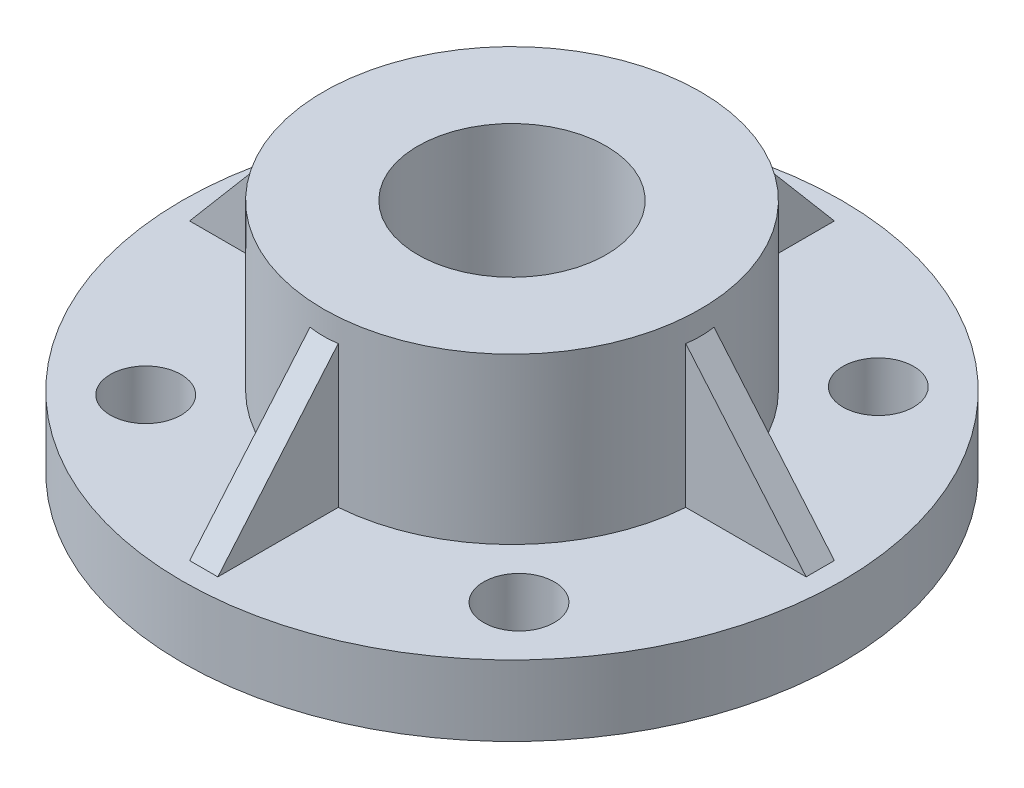
ISO-10303-21;
HEADER;
FILE_DESCRIPTION(('STEP AP214'),'2;1');
FILE_NAME('part.step','',(''),(''),'','','');
FILE_SCHEMA(('AUTOMOTIVE_DESIGN { 1 0 10303 214 1 1 1 1 }'));
ENDSEC;
DATA;
#1=APPLICATION_CONTEXT('core data for automotive mechanical design processes');
#2=APPLICATION_PROTOCOL_DEFINITION('international standard','automotive_design',2000,#1);
#3=PRODUCT_CONTEXT('',#1,'mechanical');
#4=PRODUCT('Part','Part','',(#3));
#5=PRODUCT_RELATED_PRODUCT_CATEGORY('part','',(#4));
#6=PRODUCT_DEFINITION_FORMATION('','',#4);
#7=PRODUCT_DEFINITION_CONTEXT('part definition',#1,'design');
#8=PRODUCT_DEFINITION('design','',#6,#7);
#9=PRODUCT_DEFINITION_SHAPE('','',#8);
#10=(LENGTH_UNIT() NAMED_UNIT(*) SI_UNIT(.MILLI.,.METRE.));
#11=(NAMED_UNIT(*) PLANE_ANGLE_UNIT() SI_UNIT($,.RADIAN.));
#12=(NAMED_UNIT(*) SI_UNIT($,.STERADIAN.) SOLID_ANGLE_UNIT());
#13=UNCERTAINTY_MEASURE_WITH_UNIT(LENGTH_MEASURE(1.E-05),#10,'distance_accuracy_value','');
#14=(GEOMETRIC_REPRESENTATION_CONTEXT(3) GLOBAL_UNCERTAINTY_ASSIGNED_CONTEXT((#13)) GLOBAL_UNIT_ASSIGNED_CONTEXT((#10,
#11,#12)) REPRESENTATION_CONTEXT('',''));
#15=CARTESIAN_POINT('',(0.,0.,0.));
#16=DIRECTION('',(0.,0.,1.));
#17=DIRECTION('',(1.,0.,0.));
#18=AXIS2_PLACEMENT_3D('',#15,#16,#17);
#19=CARTESIAN_POINT('',(20.,49.0897895819615,0.));
#20=DIRECTION('',(0.,1.,0.));
#21=DIRECTION('',(0.,0.,1.));
#22=AXIS2_PLACEMENT_3D('',#19,#20,#21);
#23=PLANE('',#22);
#24=CARTESIAN_POINT('',(0.,49.0897895819615,0.));
#25=DIRECTION('',(0.,-1.,0.));
#26=DIRECTION('',(0.,0.,-1.));
#27=AXIS2_PLACEMENT_3D('',#24,#25,#26);
#28=CIRCLE('',#27,20.);
#29=CARTESIAN_POINT('',(0.,49.0897895819615,-20.));
#30=VERTEX_POINT('',#29);
#31=EDGE_CURVE('E275',#30,#30,#28,.T.);
#32=ORIENTED_EDGE('',*,*,#31,.T.);
#33=EDGE_LOOP('',(#32));
#34=FACE_BOUND('',#33,.T.);
#35=CARTESIAN_POINT('',(0.,49.0897895819615,0.));
#36=DIRECTION('',(0.,-1.,0.));
#37=DIRECTION('',(0.,0.,-1.));
#38=AXIS2_PLACEMENT_3D('',#35,#36,#37);
#39=CIRCLE('',#38,40.);
#40=CARTESIAN_POINT('',(0.,49.0897895819615,-40.));
#41=VERTEX_POINT('',#40);
#42=EDGE_CURVE('E11',#41,#41,#39,.T.);
#43=ORIENTED_EDGE('',*,*,#42,.F.);
#44=EDGE_LOOP('',(#43));
#45=FACE_BOUND('',#44,.T.);
#46=ADVANCED_FACE('F43',(#34,#45),#23,.T.);
#47=CARTESIAN_POINT('',(0.,0.,0.));
#48=DIRECTION('',(0.,-1.,0.));
#49=DIRECTION('',(0.,0.,-1.));
#50=AXIS2_PLACEMENT_3D('',#47,#48,#49);
#51=CYLINDRICAL_SURFACE('',#50,40.);
#52=DIRECTION('',(0.,-1.,0.));
#53=VECTOR('',#52,1.);
#54=CARTESIAN_POINT('',(3.00000000000014,0.,-39.8873413503583));
#55=LINE('',#54,#53);
#56=CARTESIAN_POINT('',(3.00000000000014,14.0897895819615,-39.8873413503583));
#57=VERTEX_POINT('',#56);
#58=CARTESIAN_POINT('',(3.00000000000014,44.2225973757126,-39.8873413503583));
#59=VERTEX_POINT('',#58);
#60=EDGE_CURVE('E211',#57,#59,#55,.F.);
#61=ORIENTED_EDGE('',*,*,#60,.T.);
#62=CARTESIAN_POINT('',(0.,91.2438409303383,0.));
#63=DIRECTION('',(0.,-0.646888134461805,0.762584907726691));
#64=DIRECTION('',(0.,-0.762584907726691,-0.646888134461805));
#65=AXIS2_PLACEMENT_3D('',#62,#63,#64);
#66=ELLIPSE('',#65,61.8344932749138,40.);
#67=CARTESIAN_POINT('',(-2.99999999999986,44.2225973757126,-39.8873413503583));
#68=VERTEX_POINT('',#67);
#69=EDGE_CURVE('E224',#68,#59,#66,.T.);
#70=ORIENTED_EDGE('',*,*,#69,.F.);
#71=DIRECTION('',(0.,-1.,0.));
#72=VECTOR('',#71,1.);
#73=CARTESIAN_POINT('',(-2.99999999999986,0.,-39.8873413503583));
#74=LINE('',#73,#72);
#75=CARTESIAN_POINT('',(-2.99999999999986,14.0897895819615,-39.8873413503583));
#76=VERTEX_POINT('',#75);
#77=EDGE_CURVE('E218',#76,#68,#74,.F.);
#78=ORIENTED_EDGE('',*,*,#77,.F.);
#79=CARTESIAN_POINT('',(0.,14.0897895819615,0.));
#80=DIRECTION('',(0.,-1.,0.));
#81=DIRECTION('',(0.,0.,-1.));
#82=AXIS2_PLACEMENT_3D('',#79,#80,#81);
#83=CIRCLE('',#82,40.);
#84=CARTESIAN_POINT('',(-39.8873413503583,14.0897895819615,-3.));
#85=VERTEX_POINT('',#84);
#86=EDGE_CURVE('E52',#85,#76,#83,.T.);
#87=ORIENTED_EDGE('',*,*,#86,.F.);
#88=DIRECTION('',(0.,-1.,0.));
#89=VECTOR('',#88,1.);
#90=CARTESIAN_POINT('',(-39.8873413503583,0.,-3.));
#91=LINE('',#90,#89);
#92=CARTESIAN_POINT('',(-39.8873413503583,44.2225973757126,-3.));
#93=VERTEX_POINT('',#92);
#94=EDGE_CURVE('E258',#85,#93,#91,.F.);
#95=ORIENTED_EDGE('',*,*,#94,.T.);
#96=CARTESIAN_POINT('',(0.,91.2438409303383,0.));
#97=DIRECTION('',(0.762584907726691,-0.646888134461805,0.));
#98=DIRECTION('',(-0.646888134461805,-0.762584907726691,0.));
#99=AXIS2_PLACEMENT_3D('',#96,#97,#98);
#100=ELLIPSE('',#99,61.8344932749138,40.);
#101=CARTESIAN_POINT('',(-39.8873413503583,44.2225973757126,3.));
#102=VERTEX_POINT('',#101);
#103=EDGE_CURVE('E272',#102,#93,#100,.T.);
#104=ORIENTED_EDGE('',*,*,#103,.F.);
#105=DIRECTION('',(0.,-1.,0.));
#106=VECTOR('',#105,1.);
#107=CARTESIAN_POINT('',(-39.8873413503583,0.,3.));
#108=LINE('',#107,#106);
#109=CARTESIAN_POINT('',(-39.8873413503583,14.0897895819615,3.));
#110=VERTEX_POINT('',#109);
#111=EDGE_CURVE('E266',#110,#102,#108,.F.);
#112=ORIENTED_EDGE('',*,*,#111,.F.);
#113=CARTESIAN_POINT('',(-3.00000000000042,14.0897895819615,39.8873413503583));
#114=VERTEX_POINT('',#113);
#115=EDGE_CURVE('E291',#114,#110,#83,.T.);
#116=ORIENTED_EDGE('',*,*,#115,.F.);
#117=DIRECTION('',(0.,-1.,0.));
#118=VECTOR('',#117,1.);
#119=CARTESIAN_POINT('',(-3.00000000000042,0.,39.8873413503582));
#120=LINE('',#119,#118);
#121=CARTESIAN_POINT('',(-3.00000000000042,44.2225973757126,39.8873413503582));
#122=VERTEX_POINT('',#121);
#123=EDGE_CURVE('E60',#114,#122,#120,.F.);
#124=ORIENTED_EDGE('',*,*,#123,.T.);
#125=CARTESIAN_POINT('',(0.,91.2438409303383,0.));
#126=DIRECTION('',(0.,-0.646888134461805,-0.762584907726691));
#127=DIRECTION('',(0.,-0.762584907726691,0.646888134461805));
#128=AXIS2_PLACEMENT_3D('',#125,#126,#127);
#129=ELLIPSE('',#128,61.8344932749138,40.);
#130=CARTESIAN_POINT('',(2.99999999999958,44.2225973757126,39.8873413503583));
#131=VERTEX_POINT('',#130);
#132=EDGE_CURVE('E146',#131,#122,#129,.T.);
#133=ORIENTED_EDGE('',*,*,#132,.F.);
#134=DIRECTION('',(0.,-1.,0.));
#135=VECTOR('',#134,1.);
#136=CARTESIAN_POINT('',(2.99999999999958,0.,39.8873413503583));
#137=LINE('',#136,#135);
#138=CARTESIAN_POINT('',(2.99999999999959,14.0897895819615,39.8873413503583));
#139=VERTEX_POINT('',#138);
#140=EDGE_CURVE('E152',#139,#131,#137,.F.);
#141=ORIENTED_EDGE('',*,*,#140,.F.);
#142=CARTESIAN_POINT('',(39.8873413503583,14.0897895819615,3.));
#143=VERTEX_POINT('',#142);
#144=EDGE_CURVE('E160',#143,#139,#83,.T.);
#145=ORIENTED_EDGE('',*,*,#144,.F.);
#146=DIRECTION('',(0.,-1.,0.));
#147=VECTOR('',#146,1.);
#148=CARTESIAN_POINT('',(39.8873413503583,0.,3.));
#149=LINE('',#148,#147);
#150=CARTESIAN_POINT('',(39.8873413503583,44.2225973757126,3.));
#151=VERTEX_POINT('',#150);
#152=EDGE_CURVE('E68',#143,#151,#149,.F.);
#153=ORIENTED_EDGE('',*,*,#152,.T.);
#154=CARTESIAN_POINT('',(0.,91.2438409303383,0.));
#155=DIRECTION('',(-0.762584907726691,-0.646888134461805,0.));
#156=DIRECTION('',(0.646888134461805,-0.762584907726691,0.));
#157=AXIS2_PLACEMENT_3D('',#154,#155,#156);
#158=ELLIPSE('',#157,61.8344932749138,40.);
#159=CARTESIAN_POINT('',(39.8873413503583,44.2225973757126,-3.));
#160=VERTEX_POINT('',#159);
#161=EDGE_CURVE('E196',#160,#151,#158,.T.);
#162=ORIENTED_EDGE('',*,*,#161,.F.);
#163=DIRECTION('',(0.,-1.,0.));
#164=VECTOR('',#163,1.);
#165=CARTESIAN_POINT('',(39.8873413503583,0.,-3.));
#166=LINE('',#165,#164);
#167=CARTESIAN_POINT('',(39.8873413503583,14.0897895819615,-3.));
#168=VERTEX_POINT('',#167);
#169=EDGE_CURVE('E185',#168,#160,#166,.F.);
#170=ORIENTED_EDGE('',*,*,#169,.F.);
#171=EDGE_CURVE('E294',#57,#168,#83,.T.);
#172=ORIENTED_EDGE('',*,*,#171,.F.);
#173=EDGE_LOOP('',(#61,#70,#78,#87,#95,#104,#112,#116,#124,#133,#141,#145,#153,#162,#170,#172));
#174=FACE_BOUND('',#173,.T.);
#175=ORIENTED_EDGE('',*,*,#42,.T.);
#176=EDGE_LOOP('',(#175));
#177=FACE_BOUND('',#176,.T.);
#178=ADVANCED_FACE('F338',(#174,#177),#51,.T.);
#179=CARTESIAN_POINT('',(40.,14.0897895819615,0.));
#180=DIRECTION('',(0.,1.,0.));
#181=DIRECTION('',(0.,0.,1.));
#182=AXIS2_PLACEMENT_3D('',#179,#180,#181);
#183=PLANE('',#182);
#184=CARTESIAN_POINT('',(0.,14.0897895819615,0.));
#185=DIRECTION('',(0.,-1.,0.));
#186=DIRECTION('',(0.,0.,-1.));
#187=AXIS2_PLACEMENT_3D('',#184,#185,#186);
#188=CIRCLE('',#187,70.);
#189=CARTESIAN_POINT('',(0.,14.0897895819615,-70.));
#190=VERTEX_POINT('',#189);
#191=EDGE_CURVE('E287',#190,#190,#188,.T.);
#192=ORIENTED_EDGE('',*,*,#191,.F.);
#193=EDGE_LOOP('',(#192));
#194=FACE_BOUND('',#193,.T.);
#195=DIRECTION('',(1.,0.,0.));
#196=VECTOR('',#195,1.);
#197=CARTESIAN_POINT('',(40.0000000000003,14.0897895819615,-65.44850263521));
#198=LINE('',#197,#196);
#199=CARTESIAN_POINT('',(3.00000000000023,14.0897895819615,-65.4485026352101));
#200=VERTEX_POINT('',#199);
#201=CARTESIAN_POINT('',(-2.99999999999977,14.0897895819615,-65.4485026352101));
#202=VERTEX_POINT('',#201);
#203=EDGE_CURVE('E221',#200,#202,#198,.F.);
#204=ORIENTED_EDGE('',*,*,#203,.F.);
#205=DIRECTION('',(0.,0.,1.));
#206=VECTOR('',#205,1.);
#207=CARTESIAN_POINT('',(3.,14.0897895819615,-1.29184809537196E-13));
#208=LINE('',#207,#206);
#209=EDGE_CURVE('E204',#200,#57,#208,.T.);
#210=ORIENTED_EDGE('',*,*,#209,.T.);
#211=ORIENTED_EDGE('',*,*,#171,.T.);
#212=DIRECTION('',(-1.,0.,0.));
#213=VECTOR('',#212,1.);
#214=CARTESIAN_POINT('',(40.,14.0897895819615,-3.));
#215=LINE('',#214,#213);
#216=CARTESIAN_POINT('',(65.4485026352101,14.0897895819615,-3.));
#217=VERTEX_POINT('',#216);
#218=EDGE_CURVE('E180',#217,#168,#215,.T.);
#219=ORIENTED_EDGE('',*,*,#218,.F.);
#220=DIRECTION('',(0.,0.,1.));
#221=VECTOR('',#220,1.);
#222=CARTESIAN_POINT('',(65.4485026352101,14.0897895819615,0.));
#223=LINE('',#222,#221);
#224=CARTESIAN_POINT('',(65.4485026352101,14.0897895819615,3.));
#225=VERTEX_POINT('',#224);
#226=EDGE_CURVE('E193',#225,#217,#223,.F.);
#227=ORIENTED_EDGE('',*,*,#226,.F.);
#228=DIRECTION('',(-1.,0.,0.));
#229=VECTOR('',#228,1.);
#230=CARTESIAN_POINT('',(40.,14.0897895819615,3.));
#231=LINE('',#230,#229);
#232=EDGE_CURVE('E188',#225,#143,#231,.T.);
#233=ORIENTED_EDGE('',*,*,#232,.T.);
#234=ORIENTED_EDGE('',*,*,#144,.T.);
#235=DIRECTION('',(0.,0.,-1.));
#236=VECTOR('',#235,1.);
#237=CARTESIAN_POINT('',(3.,14.0897895819615,-3.87554428611588E-13));
#238=LINE('',#237,#236);
#239=CARTESIAN_POINT('',(2.99999999999932,14.0897895819615,65.4485026352102));
#240=VERTEX_POINT('',#239);
#241=EDGE_CURVE('E150',#240,#139,#238,.T.);
#242=ORIENTED_EDGE('',*,*,#241,.F.);
#243=DIRECTION('',(-1.,0.,0.));
#244=VECTOR('',#243,1.);
#245=CARTESIAN_POINT('',(39.9999999999993,14.0897895819615,65.4485026352106));
#246=LINE('',#245,#244);
#247=CARTESIAN_POINT('',(-3.00000000000069,14.0897895819615,65.4485026352101));
#248=VERTEX_POINT('',#247);
#249=EDGE_CURVE('E137',#248,#240,#246,.F.);
#250=ORIENTED_EDGE('',*,*,#249,.F.);
#251=DIRECTION('',(0.,0.,-1.));
#252=VECTOR('',#251,1.);
#253=CARTESIAN_POINT('',(-3.,14.0897895819615,-4.50401092710764E-13));
#254=LINE('',#253,#252);
#255=EDGE_CURVE('E165',#248,#114,#254,.T.);
#256=ORIENTED_EDGE('',*,*,#255,.T.);
#257=ORIENTED_EDGE('',*,*,#115,.T.);
#258=DIRECTION('',(1.,0.,0.));
#259=VECTOR('',#258,1.);
#260=CARTESIAN_POINT('',(40.,14.0897895819615,3.));
#261=LINE('',#260,#259);
#262=CARTESIAN_POINT('',(-65.4485026352101,14.0897895819615,3.));
#263=VERTEX_POINT('',#262);
#264=EDGE_CURVE('E262',#263,#110,#261,.T.);
#265=ORIENTED_EDGE('',*,*,#264,.F.);
#266=DIRECTION('',(0.,0.,-1.));
#267=VECTOR('',#266,1.);
#268=CARTESIAN_POINT('',(-65.4485026352101,14.0897895819615,0.));
#269=LINE('',#268,#267);
#270=CARTESIAN_POINT('',(-65.4485026352101,14.0897895819615,-3.));
#271=VERTEX_POINT('',#270);
#272=EDGE_CURVE('E269',#271,#263,#269,.F.);
#273=ORIENTED_EDGE('',*,*,#272,.F.);
#274=DIRECTION('',(1.,0.,0.));
#275=VECTOR('',#274,1.);
#276=CARTESIAN_POINT('',(40.,14.0897895819615,-3.));
#277=LINE('',#276,#275);
#278=EDGE_CURVE('E251',#271,#85,#277,.T.);
#279=ORIENTED_EDGE('',*,*,#278,.T.);
#280=ORIENTED_EDGE('',*,*,#86,.T.);
#281=DIRECTION('',(0.,0.,1.));
#282=VECTOR('',#281,1.);
#283=CARTESIAN_POINT('',(-3.,14.0897895819615,-1.50133697570255E-13));
#284=LINE('',#283,#282);
#285=EDGE_CURVE('E215',#202,#76,#284,.T.);
#286=ORIENTED_EDGE('',*,*,#285,.F.);
#287=EDGE_LOOP('',(#204,#210,#211,#219,#227,#233,#234,#242,#250,#256,#257,#265,#273,#279,#280,#286));
#288=FACE_BOUND('',#287,.T.);
#289=CARTESIAN_POINT('',(-38.1409322013991,14.0897895819615,39.626623510063));
#290=DIRECTION('',(0.,1.,0.));
#291=DIRECTION('',(0.,0.,1.));
#292=AXIS2_PLACEMENT_3D('',#289,#290,#291);
#293=CIRCLE('',#292,7.5);
#294=CARTESIAN_POINT('',(-38.1409322013991,14.0897895819615,47.126623510063));
#295=VERTEX_POINT('',#294);
#296=EDGE_CURVE('E242',#295,#295,#293,.T.);
#297=ORIENTED_EDGE('',*,*,#296,.F.);
#298=EDGE_LOOP('',(#297));
#299=FACE_BOUND('',#298,.T.);
#300=CARTESIAN_POINT('',(39.6266235100631,14.0897895819615,38.140932201399));
#301=DIRECTION('',(0.,1.,0.));
#302=DIRECTION('',(0.,0.,1.));
#303=AXIS2_PLACEMENT_3D('',#300,#301,#302);
#304=CIRCLE('',#303,7.50000000000001);
#305=CARTESIAN_POINT('',(39.6266235100631,14.0897895819615,45.640932201399));
#306=VERTEX_POINT('',#305);
#307=EDGE_CURVE('E238',#306,#306,#304,.T.);
#308=ORIENTED_EDGE('',*,*,#307,.F.);
#309=EDGE_LOOP('',(#308));
#310=FACE_BOUND('',#309,.T.);
#311=CARTESIAN_POINT('',(38.1409322013988,14.0897895819615,-39.6266235100633));
#312=DIRECTION('',(0.,1.,0.));
#313=DIRECTION('',(0.,0.,1.));
#314=AXIS2_PLACEMENT_3D('',#311,#312,#313);
#315=CIRCLE('',#314,7.5);
#316=CARTESIAN_POINT('',(38.1409322013988,14.0897895819615,-32.1266235100633));
#317=VERTEX_POINT('',#316);
#318=EDGE_CURVE('E233',#317,#317,#315,.T.);
#319=ORIENTED_EDGE('',*,*,#318,.F.);
#320=EDGE_LOOP('',(#319));
#321=FACE_BOUND('',#320,.T.);
#322=CARTESIAN_POINT('',(-39.6266235100634,14.0897895819615,-38.1409322013987));
#323=DIRECTION('',(0.,1.,0.));
#324=DIRECTION('',(0.,0.,1.));
#325=AXIS2_PLACEMENT_3D('',#322,#323,#324);
#326=CIRCLE('',#325,7.5);
#327=CARTESIAN_POINT('',(-39.6266235100634,14.0897895819615,-30.6409322013987));
#328=VERTEX_POINT('',#327);
#329=EDGE_CURVE('E228',#328,#328,#326,.T.);
#330=ORIENTED_EDGE('',*,*,#329,.F.);
#331=EDGE_LOOP('',(#330));
#332=FACE_BOUND('',#331,.T.);
#333=ADVANCED_FACE('F157',(#194,#288,#299,#310,#321,#332),#183,.T.);
#334=CARTESIAN_POINT('',(0.,0.,0.));
#335=DIRECTION('',(0.,-1.,0.));
#336=DIRECTION('',(0.,0.,-1.));
#337=AXIS2_PLACEMENT_3D('',#334,#335,#336);
#338=CYLINDRICAL_SURFACE('',#337,70.);
#339=CARTESIAN_POINT('',(0.,-0.910210418038515,0.));
#340=DIRECTION('',(0.,-1.,0.));
#341=DIRECTION('',(0.,0.,-1.));
#342=AXIS2_PLACEMENT_3D('',#339,#340,#341);
#343=CIRCLE('',#342,70.);
#344=CARTESIAN_POINT('',(0.,-0.910210418038515,-70.));
#345=VERTEX_POINT('',#344);
#346=EDGE_CURVE('E283',#345,#345,#343,.T.);
#347=ORIENTED_EDGE('',*,*,#346,.F.);
#348=EDGE_LOOP('',(#347));
#349=FACE_BOUND('',#348,.T.);
#350=ORIENTED_EDGE('',*,*,#191,.T.);
#351=EDGE_LOOP('',(#350));
#352=FACE_BOUND('',#351,.T.);
#353=ADVANCED_FACE('F312',(#349,#352),#338,.T.);
#354=CARTESIAN_POINT('',(20.,-0.910210418038515,0.));
#355=DIRECTION('',(0.,-1.,0.));
#356=DIRECTION('',(0.,0.,-1.));
#357=AXIS2_PLACEMENT_3D('',#354,#355,#356);
#358=PLANE('',#357);
#359=CARTESIAN_POINT('',(0.,-0.910210418038515,0.));
#360=DIRECTION('',(0.,-1.,0.));
#361=DIRECTION('',(0.,0.,-1.));
#362=AXIS2_PLACEMENT_3D('',#359,#360,#361);
#363=CIRCLE('',#362,20.);
#364=CARTESIAN_POINT('',(0.,-0.910210418038515,-20.));
#365=VERTEX_POINT('',#364);
#366=EDGE_CURVE('E279',#365,#365,#363,.T.);
#367=ORIENTED_EDGE('',*,*,#366,.F.);
#368=EDGE_LOOP('',(#367));
#369=FACE_BOUND('',#368,.T.);
#370=ORIENTED_EDGE('',*,*,#346,.T.);
#371=EDGE_LOOP('',(#370));
#372=FACE_BOUND('',#371,.T.);
#373=CARTESIAN_POINT('',(38.1409322013988,-0.910210418038515,-39.6266235100633));
#374=DIRECTION('',(0.,-1.,0.));
#375=DIRECTION('',(0.,0.,-1.));
#376=AXIS2_PLACEMENT_3D('',#373,#374,#375);
#377=CIRCLE('',#376,7.5);
#378=CARTESIAN_POINT('',(38.1409322013988,-0.910210418038515,-47.1266235100633));
#379=VERTEX_POINT('',#378);
#380=EDGE_CURVE('E232',#379,#379,#377,.T.);
#381=ORIENTED_EDGE('',*,*,#380,.F.);
#382=EDGE_LOOP('',(#381));
#383=FACE_BOUND('',#382,.T.);
#384=CARTESIAN_POINT('',(39.6266235100631,-0.910210418038515,38.140932201399));
#385=DIRECTION('',(0.,-1.,0.));
#386=DIRECTION('',(0.,0.,-1.));
#387=AXIS2_PLACEMENT_3D('',#384,#385,#386);
#388=CIRCLE('',#387,7.50000000000001);
#389=CARTESIAN_POINT('',(39.6266235100631,-0.910210418038515,30.640932201399));
#390=VERTEX_POINT('',#389);
#391=EDGE_CURVE('E237',#390,#390,#388,.T.);
#392=ORIENTED_EDGE('',*,*,#391,.F.);
#393=EDGE_LOOP('',(#392));
#394=FACE_BOUND('',#393,.T.);
#395=CARTESIAN_POINT('',(-38.1409322013991,-0.910210418038515,39.626623510063));
#396=DIRECTION('',(0.,-1.,0.));
#397=DIRECTION('',(0.,0.,-1.));
#398=AXIS2_PLACEMENT_3D('',#395,#396,#397);
#399=CIRCLE('',#398,7.5);
#400=CARTESIAN_POINT('',(-38.1409322013991,-0.910210418038515,32.126623510063));
#401=VERTEX_POINT('',#400);
#402=EDGE_CURVE('E46',#401,#401,#399,.T.);
#403=ORIENTED_EDGE('',*,*,#402,.F.);
#404=EDGE_LOOP('',(#403));
#405=FACE_BOUND('',#404,.T.);
#406=CARTESIAN_POINT('',(-39.6266235100634,-0.910210418038515,-38.1409322013987));
#407=DIRECTION('',(0.,-1.,0.));
#408=DIRECTION('',(0.,0.,-1.));
#409=AXIS2_PLACEMENT_3D('',#406,#407,#408);
#410=CIRCLE('',#409,7.5);
#411=CARTESIAN_POINT('',(-39.6266235100634,-0.910210418038515,-45.6409322013987));
#412=VERTEX_POINT('',#411);
#413=EDGE_CURVE('E227',#412,#412,#410,.T.);
#414=ORIENTED_EDGE('',*,*,#413,.F.);
#415=EDGE_LOOP('',(#414));
#416=FACE_BOUND('',#415,.T.);
#417=ADVANCED_FACE('F308',(#369,#372,#383,#394,#405,#416),#358,.T.);
#418=CARTESIAN_POINT('',(0.,0.,0.));
#419=DIRECTION('',(0.,-1.,0.));
#420=DIRECTION('',(0.,0.,-1.));
#421=AXIS2_PLACEMENT_3D('',#418,#419,#420);
#422=CYLINDRICAL_SURFACE('',#421,20.);
#423=ORIENTED_EDGE('',*,*,#366,.T.);
#424=EDGE_LOOP('',(#423));
#425=FACE_BOUND('',#424,.T.);
#426=ORIENTED_EDGE('',*,*,#31,.F.);
#427=EDGE_LOOP('',(#426));
#428=FACE_BOUND('',#427,.T.);
#429=ADVANCED_FACE('F311',(#425,#428),#422,.F.);
#430=CARTESIAN_POINT('',(-65.,14.618507489226,0.));
#431=DIRECTION('',(0.762584907726691,-0.646888134461805,0.));
#432=DIRECTION('',(0.646888134461805,0.762584907726691,0.));
#433=AXIS2_PLACEMENT_3D('',#430,#431,#432);
#434=PLANE('',#433);
#435=DIRECTION('',(0.646888134461805,0.762584907726691,0.));
#436=VECTOR('',#435,1.);
#437=CARTESIAN_POINT('',(-65.,14.618507489226,3.));
#438=LINE('',#437,#436);
#439=EDGE_CURVE('E247',#263,#102,#438,.T.);
#440=ORIENTED_EDGE('',*,*,#439,.T.);
#441=ORIENTED_EDGE('',*,*,#103,.T.);
#442=DIRECTION('',(0.646888134461805,0.762584907726691,0.));
#443=VECTOR('',#442,1.);
#444=CARTESIAN_POINT('',(-65.,14.618507489226,-3.));
#445=LINE('',#444,#443);
#446=EDGE_CURVE('E246',#271,#93,#445,.T.);
#447=ORIENTED_EDGE('',*,*,#446,.F.);
#448=ORIENTED_EDGE('',*,*,#272,.T.);
#449=EDGE_LOOP('',(#440,#441,#447,#448));
#450=FACE_BOUND('',#449,.T.);
#451=ADVANCED_FACE('F351',(#450),#434,.F.);
#452=CARTESIAN_POINT('',(0.,24.0897895819615,3.));
#453=DIRECTION('',(0.,0.,1.));
#454=DIRECTION('',(1.,0.,0.));
#455=AXIS2_PLACEMENT_3D('',#452,#453,#454);
#456=PLANE('',#455);
#457=ORIENTED_EDGE('',*,*,#264,.T.);
#458=ORIENTED_EDGE('',*,*,#111,.T.);
#459=ORIENTED_EDGE('',*,*,#439,.F.);
#460=EDGE_LOOP('',(#457,#458,#459));
#461=FACE_BOUND('',#460,.T.);
#462=ADVANCED_FACE('F332',(#461),#456,.T.);
#463=CARTESIAN_POINT('',(0.,24.0897895819615,-3.));
#464=DIRECTION('',(0.,0.,1.));
#465=DIRECTION('',(1.,0.,0.));
#466=AXIS2_PLACEMENT_3D('',#463,#464,#465);
#467=PLANE('',#466);
#468=ORIENTED_EDGE('',*,*,#94,.F.);
#469=ORIENTED_EDGE('',*,*,#278,.F.);
#470=ORIENTED_EDGE('',*,*,#446,.T.);
#471=EDGE_LOOP('',(#468,#469,#470));
#472=FACE_BOUND('',#471,.T.);
#473=ADVANCED_FACE('F323',(#472),#467,.F.);
#474=CARTESIAN_POINT('',(-39.6266235100634,-10.,-38.1409322013987));
#475=DIRECTION('',(0.,1.,0.));
#476=DIRECTION('',(0.,0.,1.));
#477=AXIS2_PLACEMENT_3D('',#474,#475,#476);
#478=CYLINDRICAL_SURFACE('',#477,7.5);
#479=ORIENTED_EDGE('',*,*,#329,.T.);
#480=EDGE_LOOP('',(#479));
#481=FACE_BOUND('',#480,.T.);
#482=ORIENTED_EDGE('',*,*,#413,.T.);
#483=EDGE_LOOP('',(#482));
#484=FACE_BOUND('',#483,.T.);
#485=ADVANCED_FACE('F320',(#481,#484),#478,.F.);
#486=CARTESIAN_POINT('',(38.1409322013988,-10.,-39.6266235100633));
#487=DIRECTION('',(0.,1.,0.));
#488=DIRECTION('',(0.,0.,1.));
#489=AXIS2_PLACEMENT_3D('',#486,#487,#488);
#490=CYLINDRICAL_SURFACE('',#489,7.5);
#491=ORIENTED_EDGE('',*,*,#318,.T.);
#492=EDGE_LOOP('',(#491));
#493=FACE_BOUND('',#492,.T.);
#494=ORIENTED_EDGE('',*,*,#380,.T.);
#495=EDGE_LOOP('',(#494));
#496=FACE_BOUND('',#495,.T.);
#497=ADVANCED_FACE('F322',(#493,#496),#490,.F.);
#498=CARTESIAN_POINT('',(39.6266235100631,-10.,38.140932201399));
#499=DIRECTION('',(0.,1.,0.));
#500=DIRECTION('',(0.,0.,1.));
#501=AXIS2_PLACEMENT_3D('',#498,#499,#500);
#502=CYLINDRICAL_SURFACE('',#501,7.50000000000001);
#503=ORIENTED_EDGE('',*,*,#307,.T.);
#504=EDGE_LOOP('',(#503));
#505=FACE_BOUND('',#504,.T.);
#506=ORIENTED_EDGE('',*,*,#391,.T.);
#507=EDGE_LOOP('',(#506));
#508=FACE_BOUND('',#507,.T.);
#509=ADVANCED_FACE('F306',(#505,#508),#502,.F.);
#510=CARTESIAN_POINT('',(-38.1409322013991,-10.,39.626623510063));
#511=DIRECTION('',(0.,1.,0.));
#512=DIRECTION('',(0.,0.,1.));
#513=AXIS2_PLACEMENT_3D('',#510,#511,#512);
#514=CYLINDRICAL_SURFACE('',#513,7.5);
#515=ORIENTED_EDGE('',*,*,#296,.T.);
#516=EDGE_LOOP('',(#515));
#517=FACE_BOUND('',#516,.T.);
#518=ORIENTED_EDGE('',*,*,#402,.T.);
#519=EDGE_LOOP('',(#518));
#520=FACE_BOUND('',#519,.T.);
#521=ADVANCED_FACE('F426',(#517,#520),#514,.F.);
#522=CARTESIAN_POINT('',(2.26946287024804E-13,14.618507489226,-65.));
#523=DIRECTION('',(0.,-0.646888134461805,0.762584907726691));
#524=DIRECTION('',(0.,0.762584907726691,0.646888134461805));
#525=AXIS2_PLACEMENT_3D('',#522,#523,#524);
#526=PLANE('',#525);
#527=DIRECTION('',(0.,0.762584907726691,0.646888134461805));
#528=VECTOR('',#527,1.);
#529=CARTESIAN_POINT('',(-2.99999999999977,14.618507489226,-65.));
#530=LINE('',#529,#528);
#531=EDGE_CURVE('E200',#202,#68,#530,.T.);
#532=ORIENTED_EDGE('',*,*,#531,.T.);
#533=ORIENTED_EDGE('',*,*,#69,.T.);
#534=DIRECTION('',(0.,0.762584907726691,0.646888134461805));
#535=VECTOR('',#534,1.);
#536=CARTESIAN_POINT('',(3.00000000000023,14.618507489226,-65.));
#537=LINE('',#536,#535);
#538=EDGE_CURVE('E199',#200,#59,#537,.T.);
#539=ORIENTED_EDGE('',*,*,#538,.F.);
#540=ORIENTED_EDGE('',*,*,#203,.T.);
#541=EDGE_LOOP('',(#532,#533,#539,#540));
#542=FACE_BOUND('',#541,.T.);
#543=ADVANCED_FACE('F435',(#542),#526,.F.);
#544=CARTESIAN_POINT('',(-3.,24.0897895819615,0.));
#545=DIRECTION('',(-1.,0.,0.));
#546=DIRECTION('',(0.,0.,1.));
#547=AXIS2_PLACEMENT_3D('',#544,#545,#546);
#548=PLANE('',#547);
#549=ORIENTED_EDGE('',*,*,#285,.T.);
#550=ORIENTED_EDGE('',*,*,#77,.T.);
#551=ORIENTED_EDGE('',*,*,#531,.F.);
#552=EDGE_LOOP('',(#549,#550,#551));
#553=FACE_BOUND('',#552,.T.);
#554=ADVANCED_FACE('F443',(#553),#548,.T.);
#555=CARTESIAN_POINT('',(3.,24.0897895819615,0.));
#556=DIRECTION('',(-1.,0.,0.));
#557=DIRECTION('',(0.,0.,1.));
#558=AXIS2_PLACEMENT_3D('',#555,#556,#557);
#559=PLANE('',#558);
#560=ORIENTED_EDGE('',*,*,#60,.F.);
#561=ORIENTED_EDGE('',*,*,#209,.F.);
#562=ORIENTED_EDGE('',*,*,#538,.T.);
#563=EDGE_LOOP('',(#560,#561,#562));
#564=FACE_BOUND('',#563,.T.);
#565=ADVANCED_FACE('F453',(#564),#559,.F.);
#566=CARTESIAN_POINT('',(65.,14.618507489226,0.));
#567=DIRECTION('',(-0.762584907726691,-0.646888134461805,0.));
#568=DIRECTION('',(-0.646888134461805,0.762584907726691,0.));
#569=AXIS2_PLACEMENT_3D('',#566,#567,#568);
#570=PLANE('',#569);
#571=DIRECTION('',(-0.646888134461805,0.762584907726691,0.));
#572=VECTOR('',#571,1.);
#573=CARTESIAN_POINT('',(65.,14.618507489226,-3.));
#574=LINE('',#573,#572);
#575=EDGE_CURVE('E176',#217,#160,#574,.T.);
#576=ORIENTED_EDGE('',*,*,#575,.T.);
#577=ORIENTED_EDGE('',*,*,#161,.T.);
#578=DIRECTION('',(-0.646888134461805,0.762584907726691,0.));
#579=VECTOR('',#578,1.);
#580=CARTESIAN_POINT('',(65.,14.618507489226,3.));
#581=LINE('',#580,#579);
#582=EDGE_CURVE('E175',#225,#151,#581,.T.);
#583=ORIENTED_EDGE('',*,*,#582,.F.);
#584=ORIENTED_EDGE('',*,*,#226,.T.);
#585=EDGE_LOOP('',(#576,#577,#583,#584));
#586=FACE_BOUND('',#585,.T.);
#587=ADVANCED_FACE('F463',(#586),#570,.F.);
#588=CARTESIAN_POINT('',(0.,24.0897895819615,3.));
#589=DIRECTION('',(0.,0.,-1.));
#590=DIRECTION('',(-1.,0.,0.));
#591=AXIS2_PLACEMENT_3D('',#588,#589,#590);
#592=PLANE('',#591);
#593=ORIENTED_EDGE('',*,*,#152,.F.);
#594=ORIENTED_EDGE('',*,*,#232,.F.);
#595=ORIENTED_EDGE('',*,*,#582,.T.);
#596=EDGE_LOOP('',(#593,#594,#595));
#597=FACE_BOUND('',#596,.T.);
#598=ADVANCED_FACE('F473',(#597),#592,.F.);
#599=CARTESIAN_POINT('',(0.,24.0897895819615,-3.));
#600=DIRECTION('',(0.,0.,-1.));
#601=DIRECTION('',(-1.,0.,0.));
#602=AXIS2_PLACEMENT_3D('',#599,#600,#601);
#603=PLANE('',#602);
#604=ORIENTED_EDGE('',*,*,#218,.T.);
#605=ORIENTED_EDGE('',*,*,#169,.T.);
#606=ORIENTED_EDGE('',*,*,#575,.F.);
#607=EDGE_LOOP('',(#604,#605,#606));
#608=FACE_BOUND('',#607,.T.);
#609=ADVANCED_FACE('F483',(#608),#603,.T.);
#610=CARTESIAN_POINT('',(-6.80838861074411E-13,14.618507489226,65.));
#611=DIRECTION('',(0.,-0.646888134461805,-0.762584907726691));
#612=DIRECTION('',(0.,0.762584907726691,-0.646888134461805));
#613=AXIS2_PLACEMENT_3D('',#610,#611,#612);
#614=PLANE('',#613);
#615=DIRECTION('',(0.,0.762584907726691,-0.646888134461805));
#616=VECTOR('',#615,1.);
#617=CARTESIAN_POINT('',(2.99999999999932,14.618507489226,65.0000000000001));
#618=LINE('',#617,#616);
#619=EDGE_CURVE('E140',#240,#131,#618,.T.);
#620=ORIENTED_EDGE('',*,*,#619,.T.);
#621=ORIENTED_EDGE('',*,*,#132,.T.);
#622=DIRECTION('',(0.,0.762584907726691,-0.646888134461805));
#623=VECTOR('',#622,1.);
#624=CARTESIAN_POINT('',(-3.00000000000068,14.618507489226,65.));
#625=LINE('',#624,#623);
#626=EDGE_CURVE('E142',#248,#122,#625,.T.);
#627=ORIENTED_EDGE('',*,*,#626,.F.);
#628=ORIENTED_EDGE('',*,*,#249,.T.);
#629=EDGE_LOOP('',(#620,#621,#627,#628));
#630=FACE_BOUND('',#629,.T.);
#631=ADVANCED_FACE('F139',(#630),#614,.F.);
#632=CARTESIAN_POINT('',(-3.,24.0897895819615,0.));
#633=DIRECTION('',(1.,0.,0.));
#634=DIRECTION('',(0.,0.,-1.));
#635=AXIS2_PLACEMENT_3D('',#632,#633,#634);
#636=PLANE('',#635);
#637=ORIENTED_EDGE('',*,*,#123,.F.);
#638=ORIENTED_EDGE('',*,*,#255,.F.);
#639=ORIENTED_EDGE('',*,*,#626,.T.);
#640=EDGE_LOOP('',(#637,#638,#639));
#641=FACE_BOUND('',#640,.T.);
#642=ADVANCED_FACE('F501',(#641),#636,.F.);
#643=CARTESIAN_POINT('',(3.,24.0897895819615,0.));
#644=DIRECTION('',(1.,0.,0.));
#645=DIRECTION('',(0.,0.,-1.));
#646=AXIS2_PLACEMENT_3D('',#643,#644,#645);
#647=PLANE('',#646);
#648=ORIENTED_EDGE('',*,*,#241,.T.);
#649=ORIENTED_EDGE('',*,*,#140,.T.);
#650=ORIENTED_EDGE('',*,*,#619,.F.);
#651=EDGE_LOOP('',(#648,#649,#650));
#652=FACE_BOUND('',#651,.T.);
#653=ADVANCED_FACE('F149',(#652),#647,.T.);
#654=CLOSED_SHELL('',(#46,#178,#333,#353,#417,#429,#451,#462,#473,#485,#497,#509,#521,#543,#554,
#565,#587,#598,#609,#631,#642,#653));
#655=MANIFOLD_SOLID_BREP('B2',#654);
#656=ADVANCED_BREP_SHAPE_REPRESENTATION('',(#18,#655),#14);
#657=SHAPE_DEFINITION_REPRESENTATION(#9,#656);
ENDSEC;
END-ISO-10303-21;
